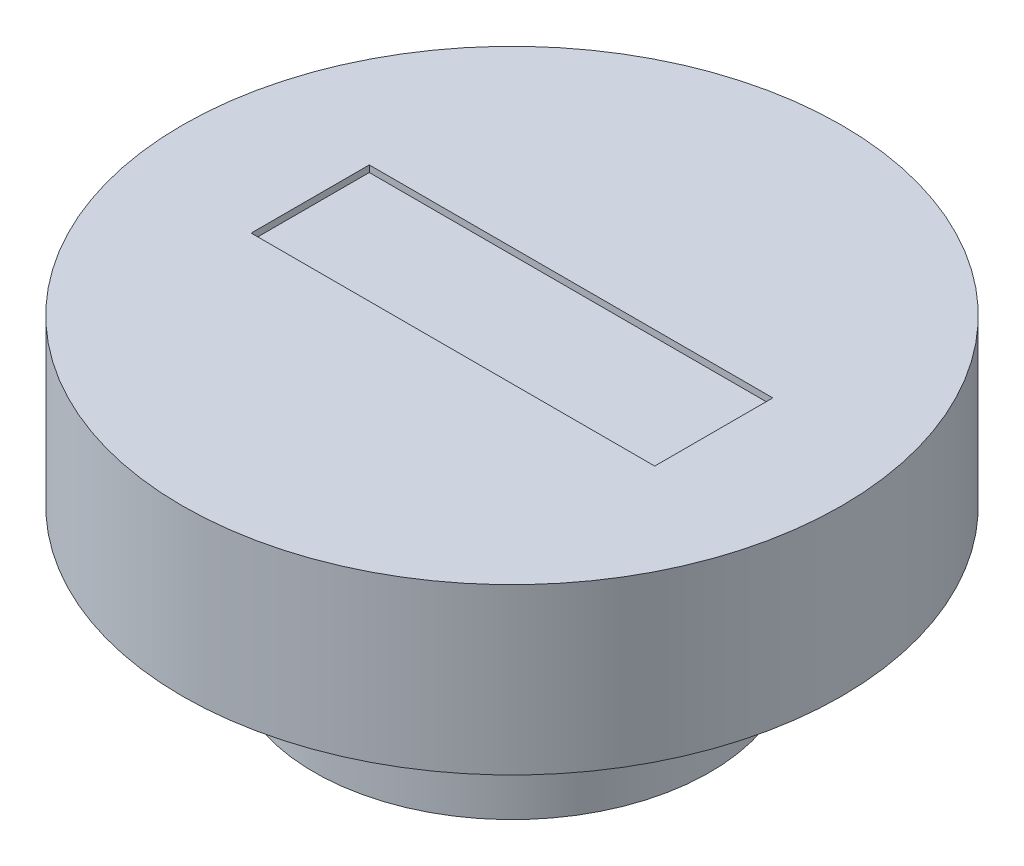
ISO-10303-21;
HEADER;
FILE_DESCRIPTION(('STEP AP214'),'2;1');
FILE_NAME('part.step','',(''),(''),'','','');
FILE_SCHEMA(('AUTOMOTIVE_DESIGN { 1 0 10303 214 1 1 1 1 }'));
ENDSEC;
DATA;
#1=APPLICATION_CONTEXT('core data for automotive mechanical design processes');
#2=APPLICATION_PROTOCOL_DEFINITION('international standard','automotive_design',2000,#1);
#3=PRODUCT_CONTEXT('',#1,'mechanical');
#4=PRODUCT('Part','Part','',(#3));
#5=PRODUCT_RELATED_PRODUCT_CATEGORY('part','',(#4));
#6=PRODUCT_DEFINITION_FORMATION('','',#4);
#7=PRODUCT_DEFINITION_CONTEXT('part definition',#1,'design');
#8=PRODUCT_DEFINITION('design','',#6,#7);
#9=PRODUCT_DEFINITION_SHAPE('','',#8);
#10=(LENGTH_UNIT() NAMED_UNIT(*) SI_UNIT(.MILLI.,.METRE.));
#11=(NAMED_UNIT(*) PLANE_ANGLE_UNIT() SI_UNIT($,.RADIAN.));
#12=(NAMED_UNIT(*) SI_UNIT($,.STERADIAN.) SOLID_ANGLE_UNIT());
#13=UNCERTAINTY_MEASURE_WITH_UNIT(LENGTH_MEASURE(1.E-05),#10,'distance_accuracy_value','');
#14=(GEOMETRIC_REPRESENTATION_CONTEXT(3) GLOBAL_UNCERTAINTY_ASSIGNED_CONTEXT((#13)) GLOBAL_UNIT_ASSIGNED_CONTEXT((#10,
#11,#12)) REPRESENTATION_CONTEXT('',''));
#15=CARTESIAN_POINT('',(0.,0.,0.));
#16=DIRECTION('',(0.,0.,1.));
#17=DIRECTION('',(1.,0.,0.));
#18=AXIS2_PLACEMENT_3D('',#15,#16,#17);
#19=CARTESIAN_POINT('',(0.,5.,0.));
#20=DIRECTION('',(0.,-1.,0.));
#21=DIRECTION('',(0.,0.,-1.));
#22=AXIS2_PLACEMENT_3D('',#19,#20,#21);
#23=CYLINDRICAL_SURFACE('',#22,10.);
#24=CARTESIAN_POINT('',(0.,5.,0.));
#25=DIRECTION('',(0.,1.,0.));
#26=DIRECTION('',(0.,0.,1.));
#27=AXIS2_PLACEMENT_3D('',#24,#25,#26);
#28=CIRCLE('',#27,10.);
#29=CARTESIAN_POINT('',(0.,5.,10.));
#30=VERTEX_POINT('',#29);
#31=EDGE_CURVE('E45',#30,#30,#28,.T.);
#32=ORIENTED_EDGE('',*,*,#31,.F.);
#33=EDGE_LOOP('',(#32));
#34=FACE_BOUND('',#33,.T.);
#35=CARTESIAN_POINT('',(0.,0.,0.));
#36=DIRECTION('',(0.,1.,0.));
#37=DIRECTION('',(0.,0.,1.));
#38=AXIS2_PLACEMENT_3D('',#35,#36,#37);
#39=CIRCLE('',#38,10.);
#40=CARTESIAN_POINT('',(0.,0.,10.));
#41=VERTEX_POINT('',#40);
#42=EDGE_CURVE('E40',#41,#41,#39,.T.);
#43=ORIENTED_EDGE('',*,*,#42,.T.);
#44=EDGE_LOOP('',(#43));
#45=FACE_BOUND('',#44,.T.);
#46=ADVANCED_FACE('F37',(#34,#45),#23,.T.);
#47=CARTESIAN_POINT('',(0.,5.,0.));
#48=DIRECTION('',(0.,1.,0.));
#49=DIRECTION('',(0.,0.,1.));
#50=AXIS2_PLACEMENT_3D('',#47,#48,#49);
#51=PLANE('',#50);
#52=DIRECTION('',(0.,0.,1.));
#53=VECTOR('',#52,1.);
#54=CARTESIAN_POINT('',(-6.11969673835763,5.,1.79078683357473));
#55=LINE('',#54,#53);
#56=CARTESIAN_POINT('',(-6.11969673835763,5.,-1.79078683357473));
#57=VERTEX_POINT('',#56);
#58=CARTESIAN_POINT('',(-6.11969673835763,5.,1.79078683357473));
#59=VERTEX_POINT('',#58);
#60=EDGE_CURVE('E53',#57,#59,#55,.T.);
#61=ORIENTED_EDGE('',*,*,#60,.F.);
#62=DIRECTION('',(-1.,0.,0.));
#63=VECTOR('',#62,1.);
#64=CARTESIAN_POINT('',(6.11969673835763,5.,-1.79078683357473));
#65=LINE('',#64,#63);
#66=CARTESIAN_POINT('',(6.11969673835763,5.,-1.79078683357473));
#67=VERTEX_POINT('',#66);
#68=EDGE_CURVE('E104',#67,#57,#65,.T.);
#69=ORIENTED_EDGE('',*,*,#68,.F.);
#70=DIRECTION('',(0.,0.,-1.));
#71=VECTOR('',#70,1.);
#72=CARTESIAN_POINT('',(6.11969673835763,5.,1.79078683357473));
#73=LINE('',#72,#71);
#74=CARTESIAN_POINT('',(6.11969673835763,5.,1.79078683357473));
#75=VERTEX_POINT('',#74);
#76=EDGE_CURVE('E110',#75,#67,#73,.T.);
#77=ORIENTED_EDGE('',*,*,#76,.F.);
#78=DIRECTION('',(1.,0.,0.));
#79=VECTOR('',#78,1.);
#80=CARTESIAN_POINT('',(6.11969673835763,5.,1.79078683357473));
#81=LINE('',#80,#79);
#82=EDGE_CURVE('E88',#59,#75,#81,.T.);
#83=ORIENTED_EDGE('',*,*,#82,.F.);
#84=EDGE_LOOP('',(#61,#69,#77,#83));
#85=FACE_BOUND('',#84,.T.);
#86=ORIENTED_EDGE('',*,*,#31,.T.);
#87=EDGE_LOOP('',(#86));
#88=FACE_BOUND('',#87,.T.);
#89=ADVANCED_FACE('F128',(#85,#88),#51,.T.);
#90=CARTESIAN_POINT('',(0.,0.,0.));
#91=DIRECTION('',(0.,1.,0.));
#92=DIRECTION('',(0.,0.,1.));
#93=AXIS2_PLACEMENT_3D('',#90,#91,#92);
#94=PLANE('',#93);
#95=CARTESIAN_POINT('',(0.,0.,0.));
#96=DIRECTION('',(0.,-1.,0.));
#97=DIRECTION('',(0.,0.,-1.));
#98=AXIS2_PLACEMENT_3D('',#95,#96,#97);
#99=CIRCLE('',#98,6.);
#100=CARTESIAN_POINT('',(0.,0.,-6.));
#101=VERTEX_POINT('',#100);
#102=EDGE_CURVE('E11',#101,#101,#99,.T.);
#103=ORIENTED_EDGE('',*,*,#102,.F.);
#104=EDGE_LOOP('',(#103));
#105=FACE_BOUND('',#104,.T.);
#106=ORIENTED_EDGE('',*,*,#42,.F.);
#107=EDGE_LOOP('',(#106));
#108=FACE_BOUND('',#107,.T.);
#109=ADVANCED_FACE('F125',(#105,#108),#94,.F.);
#110=CARTESIAN_POINT('',(0.,-4.,0.));
#111=DIRECTION('',(0.,1.,0.));
#112=DIRECTION('',(0.,0.,1.));
#113=AXIS2_PLACEMENT_3D('',#110,#111,#112);
#114=CYLINDRICAL_SURFACE('',#113,6.);
#115=CARTESIAN_POINT('',(0.,-4.,0.));
#116=DIRECTION('',(0.,-1.,0.));
#117=DIRECTION('',(0.,0.,-1.));
#118=AXIS2_PLACEMENT_3D('',#115,#116,#117);
#119=CIRCLE('',#118,6.);
#120=CARTESIAN_POINT('',(0.,-4.,-6.));
#121=VERTEX_POINT('',#120);
#122=EDGE_CURVE('E114',#121,#121,#119,.T.);
#123=ORIENTED_EDGE('',*,*,#122,.F.);
#124=EDGE_LOOP('',(#123));
#125=FACE_BOUND('',#124,.T.);
#126=ORIENTED_EDGE('',*,*,#102,.T.);
#127=EDGE_LOOP('',(#126));
#128=FACE_BOUND('',#127,.T.);
#129=ADVANCED_FACE('F127',(#125,#128),#114,.T.);
#130=CARTESIAN_POINT('',(0.,-4.,0.));
#131=DIRECTION('',(0.,-1.,0.));
#132=DIRECTION('',(0.,0.,-1.));
#133=AXIS2_PLACEMENT_3D('',#130,#131,#132);
#134=PLANE('',#133);
#135=ORIENTED_EDGE('',*,*,#122,.T.);
#136=EDGE_LOOP('',(#135));
#137=FACE_BOUND('',#136,.T.);
#138=ADVANCED_FACE('F134',(#137),#134,.T.);
#139=CARTESIAN_POINT('',(-6.11969673835763,4.8,1.79078683357473));
#140=DIRECTION('',(-1.,0.,0.));
#141=DIRECTION('',(0.,0.,1.));
#142=AXIS2_PLACEMENT_3D('',#139,#140,#141);
#143=PLANE('',#142);
#144=ORIENTED_EDGE('',*,*,#60,.T.);
#145=DIRECTION('',(0.,1.,0.));
#146=VECTOR('',#145,1.);
#147=CARTESIAN_POINT('',(-6.11969673835763,4.8,1.79078683357473));
#148=LINE('',#147,#146);
#149=CARTESIAN_POINT('',(-6.11969673835763,4.8,1.79078683357473));
#150=VERTEX_POINT('',#149);
#151=EDGE_CURVE('E76',#150,#59,#148,.T.);
#152=ORIENTED_EDGE('',*,*,#151,.F.);
#153=DIRECTION('',(0.,0.,1.));
#154=VECTOR('',#153,1.);
#155=CARTESIAN_POINT('',(-6.11969673835763,4.8,1.79078683357473));
#156=LINE('',#155,#154);
#157=CARTESIAN_POINT('',(-6.11969673835763,4.8,-1.79078683357473));
#158=VERTEX_POINT('',#157);
#159=EDGE_CURVE('E102',#158,#150,#156,.T.);
#160=ORIENTED_EDGE('',*,*,#159,.F.);
#161=DIRECTION('',(0.,1.,0.));
#162=VECTOR('',#161,1.);
#163=CARTESIAN_POINT('',(-6.11969673835763,4.8,-1.79078683357473));
#164=LINE('',#163,#162);
#165=EDGE_CURVE('E61',#158,#57,#164,.T.);
#166=ORIENTED_EDGE('',*,*,#165,.T.);
#167=EDGE_LOOP('',(#144,#152,#160,#166));
#168=FACE_BOUND('',#167,.T.);
#169=ADVANCED_FACE('F168',(#168),#143,.F.);
#170=CARTESIAN_POINT('',(6.11969673835763,4.8,-1.79078683357473));
#171=DIRECTION('',(0.,0.,-1.));
#172=DIRECTION('',(-1.,0.,0.));
#173=AXIS2_PLACEMENT_3D('',#170,#171,#172);
#174=PLANE('',#173);
#175=ORIENTED_EDGE('',*,*,#68,.T.);
#176=ORIENTED_EDGE('',*,*,#165,.F.);
#177=DIRECTION('',(-1.,0.,0.));
#178=VECTOR('',#177,1.);
#179=CARTESIAN_POINT('',(6.11969673835763,4.8,-1.79078683357473));
#180=LINE('',#179,#178);
#181=CARTESIAN_POINT('',(6.11969673835763,4.8,-1.79078683357473));
#182=VERTEX_POINT('',#181);
#183=EDGE_CURVE('E99',#182,#158,#180,.T.);
#184=ORIENTED_EDGE('',*,*,#183,.F.);
#185=DIRECTION('',(0.,1.,0.));
#186=VECTOR('',#185,1.);
#187=CARTESIAN_POINT('',(6.11969673835763,4.8,-1.79078683357473));
#188=LINE('',#187,#186);
#189=EDGE_CURVE('E92',#182,#67,#188,.T.);
#190=ORIENTED_EDGE('',*,*,#189,.T.);
#191=EDGE_LOOP('',(#175,#176,#184,#190));
#192=FACE_BOUND('',#191,.T.);
#193=ADVANCED_FACE('F178',(#192),#174,.F.);
#194=CARTESIAN_POINT('',(6.11969673835763,4.8,1.79078683357473));
#195=DIRECTION('',(1.,0.,0.));
#196=DIRECTION('',(0.,0.,-1.));
#197=AXIS2_PLACEMENT_3D('',#194,#195,#196);
#198=PLANE('',#197);
#199=ORIENTED_EDGE('',*,*,#76,.T.);
#200=ORIENTED_EDGE('',*,*,#189,.F.);
#201=DIRECTION('',(0.,0.,-1.));
#202=VECTOR('',#201,1.);
#203=CARTESIAN_POINT('',(6.11969673835763,4.8,1.79078683357473));
#204=LINE('',#203,#202);
#205=CARTESIAN_POINT('',(6.11969673835763,4.8,1.79078683357473));
#206=VERTEX_POINT('',#205);
#207=EDGE_CURVE('E95',#206,#182,#204,.T.);
#208=ORIENTED_EDGE('',*,*,#207,.F.);
#209=DIRECTION('',(0.,1.,0.));
#210=VECTOR('',#209,1.);
#211=CARTESIAN_POINT('',(6.11969673835763,4.8,1.79078683357473));
#212=LINE('',#211,#210);
#213=EDGE_CURVE('E81',#206,#75,#212,.T.);
#214=ORIENTED_EDGE('',*,*,#213,.T.);
#215=EDGE_LOOP('',(#199,#200,#208,#214));
#216=FACE_BOUND('',#215,.T.);
#217=ADVANCED_FACE('F96',(#216),#198,.F.);
#218=CARTESIAN_POINT('',(6.11969673835763,4.8,1.79078683357473));
#219=DIRECTION('',(0.,0.,1.));
#220=DIRECTION('',(1.,0.,0.));
#221=AXIS2_PLACEMENT_3D('',#218,#219,#220);
#222=PLANE('',#221);
#223=ORIENTED_EDGE('',*,*,#82,.T.);
#224=ORIENTED_EDGE('',*,*,#213,.F.);
#225=DIRECTION('',(1.,0.,0.));
#226=VECTOR('',#225,1.);
#227=CARTESIAN_POINT('',(6.11969673835763,4.8,1.79078683357473));
#228=LINE('',#227,#226);
#229=EDGE_CURVE('E85',#150,#206,#228,.T.);
#230=ORIENTED_EDGE('',*,*,#229,.F.);
#231=ORIENTED_EDGE('',*,*,#151,.T.);
#232=EDGE_LOOP('',(#223,#224,#230,#231));
#233=FACE_BOUND('',#232,.T.);
#234=ADVANCED_FACE('F83',(#233),#222,.F.);
#235=CARTESIAN_POINT('',(0.,4.8,0.));
#236=DIRECTION('',(0.,1.,0.));
#237=DIRECTION('',(0.,0.,1.));
#238=AXIS2_PLACEMENT_3D('',#235,#236,#237);
#239=PLANE('',#238);
#240=ORIENTED_EDGE('',*,*,#159,.T.);
#241=ORIENTED_EDGE('',*,*,#229,.T.);
#242=ORIENTED_EDGE('',*,*,#207,.T.);
#243=ORIENTED_EDGE('',*,*,#183,.T.);
#244=EDGE_LOOP('',(#240,#241,#242,#243));
#245=FACE_BOUND('',#244,.T.);
#246=ADVANCED_FACE('F101',(#245),#239,.T.);
#247=CLOSED_SHELL('',(#46,#89,#109,#129,#138,#169,#193,#217,#234,#246));
#248=MANIFOLD_SOLID_BREP('B2',#247);
#249=ADVANCED_BREP_SHAPE_REPRESENTATION('',(#18,#248),#14);
#250=SHAPE_DEFINITION_REPRESENTATION(#9,#249);
ENDSEC;
END-ISO-10303-21;
